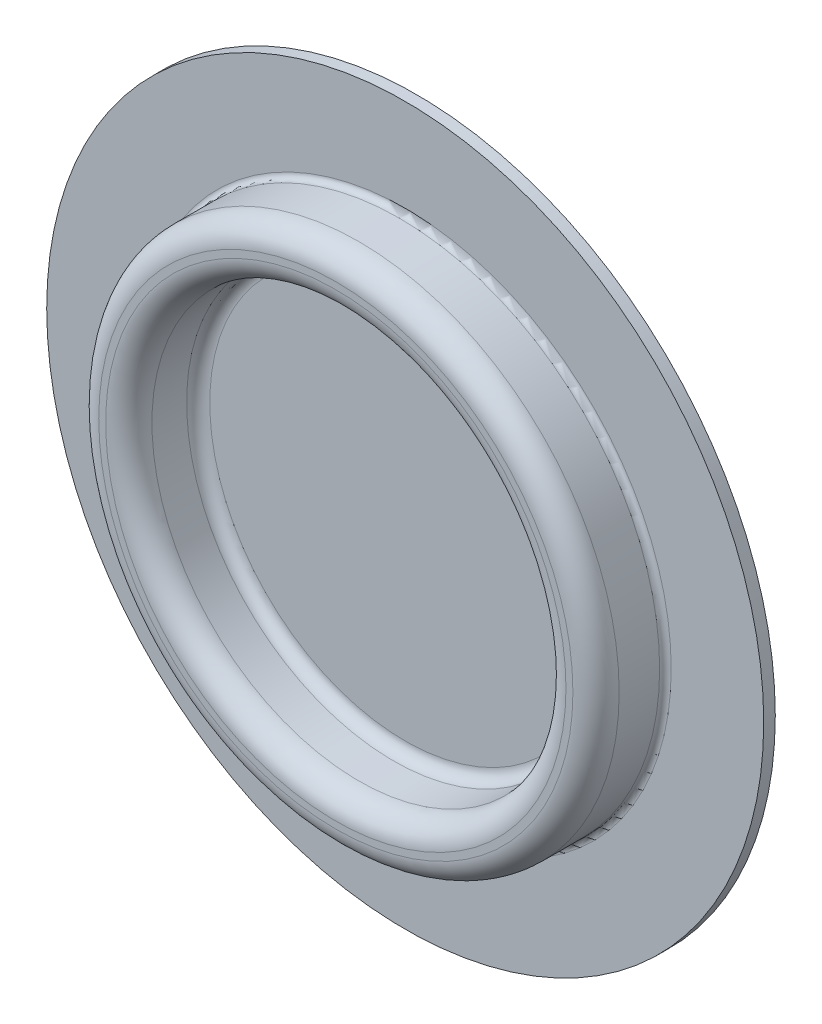
ISO-10303-21;
HEADER;
FILE_DESCRIPTION(('STEP AP214'),'2;1');
FILE_NAME('part.step','',(''),(''),'','','');
FILE_SCHEMA(('AUTOMOTIVE_DESIGN { 1 0 10303 214 1 1 1 1 }'));
ENDSEC;
DATA;
#1=APPLICATION_CONTEXT('core data for automotive mechanical design processes');
#2=APPLICATION_PROTOCOL_DEFINITION('international standard','automotive_design',2000,#1);
#3=PRODUCT_CONTEXT('',#1,'mechanical');
#4=PRODUCT('Part','Part','',(#3));
#5=PRODUCT_RELATED_PRODUCT_CATEGORY('part','',(#4));
#6=PRODUCT_DEFINITION_FORMATION('','',#4);
#7=PRODUCT_DEFINITION_CONTEXT('part definition',#1,'design');
#8=PRODUCT_DEFINITION('design','',#6,#7);
#9=PRODUCT_DEFINITION_SHAPE('','',#8);
#10=(LENGTH_UNIT() NAMED_UNIT(*) SI_UNIT(.MILLI.,.METRE.));
#11=(NAMED_UNIT(*) PLANE_ANGLE_UNIT() SI_UNIT($,.RADIAN.));
#12=(NAMED_UNIT(*) SI_UNIT($,.STERADIAN.) SOLID_ANGLE_UNIT());
#13=UNCERTAINTY_MEASURE_WITH_UNIT(LENGTH_MEASURE(1.E-05),#10,'distance_accuracy_value','');
#14=(GEOMETRIC_REPRESENTATION_CONTEXT(3) GLOBAL_UNCERTAINTY_ASSIGNED_CONTEXT((#13)) GLOBAL_UNIT_ASSIGNED_CONTEXT((#10,
#11,#12)) REPRESENTATION_CONTEXT('',''));
#15=CARTESIAN_POINT('',(0.,0.,0.));
#16=DIRECTION('',(0.,0.,1.));
#17=DIRECTION('',(1.,0.,0.));
#18=AXIS2_PLACEMENT_3D('',#15,#16,#17);
#19=CARTESIAN_POINT('',(0.,0.,74.4769920566214));
#20=DIRECTION('',(0.,0.,1.));
#21=DIRECTION('',(1.,0.,0.));
#22=AXIS2_PLACEMENT_3D('',#19,#20,#21);
#23=CYLINDRICAL_SURFACE('',#22,31.);
#24=CARTESIAN_POINT('',(0.,0.,1.));
#25=DIRECTION('',(0.,0.,1.));
#26=DIRECTION('',(1.,0.,0.));
#27=AXIS2_PLACEMENT_3D('',#24,#25,#26);
#28=CIRCLE('',#27,31.);
#29=CARTESIAN_POINT('',(31.,0.,1.));
#30=VERTEX_POINT('',#29);
#31=EDGE_CURVE('E10',#30,#30,#28,.T.);
#32=ORIENTED_EDGE('',*,*,#31,.F.);
#33=EDGE_LOOP('',(#32));
#34=FACE_BOUND('',#33,.T.);
#35=CARTESIAN_POINT('',(0.,0.,0.));
#36=DIRECTION('',(0.,0.,1.));
#37=DIRECTION('',(1.,0.,0.));
#38=AXIS2_PLACEMENT_3D('',#35,#36,#37);
#39=CIRCLE('',#38,31.);
#40=CARTESIAN_POINT('',(31.,0.,0.));
#41=VERTEX_POINT('',#40);
#42=EDGE_CURVE('E91',#41,#41,#39,.T.);
#43=ORIENTED_EDGE('',*,*,#42,.T.);
#44=EDGE_LOOP('',(#43));
#45=FACE_BOUND('',#44,.T.);
#46=ADVANCED_FACE('F33',(#34,#45),#23,.T.);
#47=CARTESIAN_POINT('',(0.,31.,1.));
#48=DIRECTION('',(0.,0.,-1.));
#49=DIRECTION('',(-1.,0.,0.));
#50=AXIS2_PLACEMENT_3D('',#47,#48,#49);
#51=PLANE('',#50);
#52=CARTESIAN_POINT('',(0.,0.,1.));
#53=DIRECTION('',(0.,0.,1.));
#54=DIRECTION('',(1.,0.,0.));
#55=AXIS2_PLACEMENT_3D('',#52,#53,#54);
#56=CIRCLE('',#55,23.);
#57=CARTESIAN_POINT('',(23.,0.,1.));
#58=VERTEX_POINT('',#57);
#59=EDGE_CURVE('E39',#58,#58,#56,.T.);
#60=ORIENTED_EDGE('',*,*,#59,.F.);
#61=EDGE_LOOP('',(#60));
#62=FACE_BOUND('',#61,.T.);
#63=ORIENTED_EDGE('',*,*,#31,.T.);
#64=EDGE_LOOP('',(#63));
#65=FACE_BOUND('',#64,.T.);
#66=ADVANCED_FACE('F155',(#62,#65),#51,.F.);
#67=CARTESIAN_POINT('',(0.,0.,1.5));
#68=DIRECTION('',(0.,0.,1.));
#69=DIRECTION('',(1.,0.,0.));
#70=AXIS2_PLACEMENT_3D('',#67,#68,#69);
#71=TOROIDAL_SURFACE('',#70,23.,0.5);
#72=CARTESIAN_POINT('',(0.,0.,1.5));
#73=DIRECTION('',(0.,0.,1.));
#74=DIRECTION('',(1.,0.,0.));
#75=AXIS2_PLACEMENT_3D('',#72,#73,#74);
#76=CIRCLE('',#75,22.5);
#77=CARTESIAN_POINT('',(22.5,0.,1.5));
#78=VERTEX_POINT('',#77);
#79=EDGE_CURVE('E43',#78,#78,#76,.T.);
#80=ORIENTED_EDGE('',*,*,#79,.F.);
#81=EDGE_LOOP('',(#80));
#82=FACE_BOUND('',#81,.T.);
#83=ORIENTED_EDGE('',*,*,#59,.T.);
#84=EDGE_LOOP('',(#83));
#85=FACE_BOUND('',#84,.T.);
#86=ADVANCED_FACE('F160',(#82,#85),#71,.F.);
#87=CARTESIAN_POINT('',(0.,0.,74.4769920566214));
#88=DIRECTION('',(0.,0.,1.));
#89=DIRECTION('',(1.,0.,0.));
#90=AXIS2_PLACEMENT_3D('',#87,#88,#89);
#91=CYLINDRICAL_SURFACE('',#90,22.5);
#92=CARTESIAN_POINT('',(0.,0.,5.));
#93=DIRECTION('',(0.,0.,1.));
#94=DIRECTION('',(1.,0.,0.));
#95=AXIS2_PLACEMENT_3D('',#92,#93,#94);
#96=CIRCLE('',#95,22.5);
#97=CARTESIAN_POINT('',(22.5,0.,5.));
#98=VERTEX_POINT('',#97);
#99=EDGE_CURVE('E47',#98,#98,#96,.T.);
#100=ORIENTED_EDGE('',*,*,#99,.F.);
#101=EDGE_LOOP('',(#100));
#102=FACE_BOUND('',#101,.T.);
#103=ORIENTED_EDGE('',*,*,#79,.T.);
#104=EDGE_LOOP('',(#103));
#105=FACE_BOUND('',#104,.T.);
#106=ADVANCED_FACE('F165',(#102,#105),#91,.T.);
#107=CARTESIAN_POINT('',(0.,0.,5.));
#108=DIRECTION('',(0.,0.,1.));
#109=DIRECTION('',(1.,0.,0.));
#110=AXIS2_PLACEMENT_3D('',#107,#108,#109);
#111=TOROIDAL_SURFACE('',#110,20.5,2.);
#112=CARTESIAN_POINT('',(0.,0.,7.00000000000001));
#113=DIRECTION('',(0.,0.,1.));
#114=DIRECTION('',(1.,0.,0.));
#115=AXIS2_PLACEMENT_3D('',#112,#113,#114);
#116=CIRCLE('',#115,20.5);
#117=CARTESIAN_POINT('',(20.5,0.,7.00000000000001));
#118=VERTEX_POINT('',#117);
#119=EDGE_CURVE('E52',#118,#118,#116,.T.);
#120=ORIENTED_EDGE('',*,*,#119,.F.);
#121=EDGE_LOOP('',(#120));
#122=FACE_BOUND('',#121,.T.);
#123=ORIENTED_EDGE('',*,*,#99,.T.);
#124=EDGE_LOOP('',(#123));
#125=FACE_BOUND('',#124,.T.);
#126=ADVANCED_FACE('F171',(#122,#125),#111,.T.);
#127=CARTESIAN_POINT('',(0.,20.5,7.));
#128=DIRECTION('',(0.,0.,-1.));
#129=DIRECTION('',(-1.,0.,0.));
#130=AXIS2_PLACEMENT_3D('',#127,#128,#129);
#131=PLANE('',#130);
#132=CARTESIAN_POINT('',(0.,0.,7.00000000000001));
#133=DIRECTION('',(0.,0.,1.));
#134=DIRECTION('',(1.,0.,0.));
#135=AXIS2_PLACEMENT_3D('',#132,#133,#134);
#136=CIRCLE('',#135,19.9);
#137=CARTESIAN_POINT('',(19.9,0.,7.00000000000001));
#138=VERTEX_POINT('',#137);
#139=EDGE_CURVE('E55',#138,#138,#136,.T.);
#140=ORIENTED_EDGE('',*,*,#139,.F.);
#141=EDGE_LOOP('',(#140));
#142=FACE_BOUND('',#141,.T.);
#143=ORIENTED_EDGE('',*,*,#119,.T.);
#144=EDGE_LOOP('',(#143));
#145=FACE_BOUND('',#144,.T.);
#146=ADVANCED_FACE('F175',(#142,#145),#131,.F.);
#147=CARTESIAN_POINT('',(0.,0.,5.));
#148=DIRECTION('',(0.,0.,1.));
#149=DIRECTION('',(1.,0.,0.));
#150=AXIS2_PLACEMENT_3D('',#147,#148,#149);
#151=TOROIDAL_SURFACE('',#150,19.9,2.);
#152=CARTESIAN_POINT('',(0.,0.,4.99999999999999));
#153=DIRECTION('',(0.,0.,1.));
#154=DIRECTION('',(1.,0.,0.));
#155=AXIS2_PLACEMENT_3D('',#152,#153,#154);
#156=CIRCLE('',#155,17.9);
#157=CARTESIAN_POINT('',(17.9,0.,4.99999999999999));
#158=VERTEX_POINT('',#157);
#159=EDGE_CURVE('E58',#158,#158,#156,.T.);
#160=ORIENTED_EDGE('',*,*,#159,.F.);
#161=EDGE_LOOP('',(#160));
#162=FACE_BOUND('',#161,.T.);
#163=ORIENTED_EDGE('',*,*,#139,.T.);
#164=EDGE_LOOP('',(#163));
#165=FACE_BOUND('',#164,.T.);
#166=ADVANCED_FACE('F179',(#162,#165),#151,.T.);
#167=CARTESIAN_POINT('',(0.,0.,74.4769920566214));
#168=DIRECTION('',(0.,0.,1.));
#169=DIRECTION('',(1.,0.,0.));
#170=AXIS2_PLACEMENT_3D('',#167,#168,#169);
#171=CYLINDRICAL_SURFACE('',#170,17.9);
#172=CARTESIAN_POINT('',(0.,0.,2.));
#173=DIRECTION('',(0.,0.,1.));
#174=DIRECTION('',(1.,0.,0.));
#175=AXIS2_PLACEMENT_3D('',#172,#173,#174);
#176=CIRCLE('',#175,17.9);
#177=CARTESIAN_POINT('',(17.9,0.,2.));
#178=VERTEX_POINT('',#177);
#179=EDGE_CURVE('E61',#178,#178,#176,.T.);
#180=ORIENTED_EDGE('',*,*,#179,.F.);
#181=EDGE_LOOP('',(#180));
#182=FACE_BOUND('',#181,.T.);
#183=ORIENTED_EDGE('',*,*,#159,.T.);
#184=EDGE_LOOP('',(#183));
#185=FACE_BOUND('',#184,.T.);
#186=ADVANCED_FACE('F183',(#182,#185),#171,.F.);
#187=CARTESIAN_POINT('',(0.,0.,2.));
#188=DIRECTION('',(0.,0.,1.));
#189=DIRECTION('',(1.,0.,0.));
#190=AXIS2_PLACEMENT_3D('',#187,#188,#189);
#191=TOROIDAL_SURFACE('',#190,16.9,0.999999999999999);
#192=CARTESIAN_POINT('',(0.,0.,1.));
#193=DIRECTION('',(0.,0.,1.));
#194=DIRECTION('',(1.,0.,0.));
#195=AXIS2_PLACEMENT_3D('',#192,#193,#194);
#196=CIRCLE('',#195,16.9);
#197=CARTESIAN_POINT('',(16.9,0.,1.));
#198=VERTEX_POINT('',#197);
#199=EDGE_CURVE('E64',#198,#198,#196,.T.);
#200=ORIENTED_EDGE('',*,*,#199,.F.);
#201=EDGE_LOOP('',(#200));
#202=FACE_BOUND('',#201,.T.);
#203=ORIENTED_EDGE('',*,*,#179,.T.);
#204=EDGE_LOOP('',(#203));
#205=FACE_BOUND('',#204,.T.);
#206=ADVANCED_FACE('F151',(#202,#205),#191,.F.);
#207=CARTESIAN_POINT('',(0.,1.57282630399508E-10,0.999999999997762));
#208=DIRECTION('',(0.,0.,-1.));
#209=DIRECTION('',(-1.,0.,0.));
#210=AXIS2_PLACEMENT_3D('',#207,#208,#209);
#211=PLANE('',#210);
#212=ORIENTED_EDGE('',*,*,#199,.T.);
#213=EDGE_LOOP('',(#212));
#214=FACE_BOUND('',#213,.T.);
#215=ADVANCED_FACE('F146',(#214),#211,.F.);
#216=CARTESIAN_POINT('',(0.,0.,-2.36788366692053E-09));
#217=DIRECTION('',(0.,0.,1.));
#218=DIRECTION('',(1.,0.,0.));
#219=AXIS2_PLACEMENT_3D('',#216,#217,#218);
#220=PLANE('',#219);
#221=CARTESIAN_POINT('',(0.,0.,0.));
#222=DIRECTION('',(0.,0.,1.));
#223=DIRECTION('',(1.,0.,0.));
#224=AXIS2_PLACEMENT_3D('',#221,#222,#223);
#225=CIRCLE('',#224,16.9);
#226=CARTESIAN_POINT('',(16.9,0.,0.));
#227=VERTEX_POINT('',#226);
#228=EDGE_CURVE('E67',#227,#227,#225,.T.);
#229=ORIENTED_EDGE('',*,*,#228,.F.);
#230=EDGE_LOOP('',(#229));
#231=FACE_BOUND('',#230,.T.);
#232=ADVANCED_FACE('F141',(#231),#220,.F.);
#233=CARTESIAN_POINT('',(0.,0.,2.));
#234=DIRECTION('',(0.,0.,1.));
#235=DIRECTION('',(1.,0.,0.));
#236=AXIS2_PLACEMENT_3D('',#233,#234,#235);
#237=TOROIDAL_SURFACE('',#236,16.9,2.);
#238=CARTESIAN_POINT('',(0.,0.,2.));
#239=DIRECTION('',(0.,0.,1.));
#240=DIRECTION('',(1.,0.,0.));
#241=AXIS2_PLACEMENT_3D('',#238,#239,#240);
#242=CIRCLE('',#241,18.9);
#243=CARTESIAN_POINT('',(18.9,0.,2.));
#244=VERTEX_POINT('',#243);
#245=EDGE_CURVE('E70',#244,#244,#242,.T.);
#246=ORIENTED_EDGE('',*,*,#245,.F.);
#247=EDGE_LOOP('',(#246));
#248=FACE_BOUND('',#247,.T.);
#249=ORIENTED_EDGE('',*,*,#228,.T.);
#250=EDGE_LOOP('',(#249));
#251=FACE_BOUND('',#250,.T.);
#252=ADVANCED_FACE('F135',(#248,#251),#237,.T.);
#253=CARTESIAN_POINT('',(0.,0.,74.4769920566214));
#254=DIRECTION('',(0.,0.,1.));
#255=DIRECTION('',(1.,0.,0.));
#256=AXIS2_PLACEMENT_3D('',#253,#254,#255);
#257=CYLINDRICAL_SURFACE('',#256,18.9);
#258=CARTESIAN_POINT('',(0.,0.,4.99999999999999));
#259=DIRECTION('',(0.,0.,1.));
#260=DIRECTION('',(1.,0.,0.));
#261=AXIS2_PLACEMENT_3D('',#258,#259,#260);
#262=CIRCLE('',#261,18.9);
#263=CARTESIAN_POINT('',(18.9,0.,4.99999999999999));
#264=VERTEX_POINT('',#263);
#265=EDGE_CURVE('E73',#264,#264,#262,.T.);
#266=ORIENTED_EDGE('',*,*,#265,.F.);
#267=EDGE_LOOP('',(#266));
#268=FACE_BOUND('',#267,.T.);
#269=ORIENTED_EDGE('',*,*,#245,.T.);
#270=EDGE_LOOP('',(#269));
#271=FACE_BOUND('',#270,.T.);
#272=ADVANCED_FACE('F129',(#268,#271),#257,.T.);
#273=CARTESIAN_POINT('',(0.,0.,5.));
#274=DIRECTION('',(0.,0.,1.));
#275=DIRECTION('',(1.,0.,0.));
#276=AXIS2_PLACEMENT_3D('',#273,#274,#275);
#277=TOROIDAL_SURFACE('',#276,19.9,1.);
#278=CARTESIAN_POINT('',(0.,0.,6.00000000000001));
#279=DIRECTION('',(0.,0.,1.));
#280=DIRECTION('',(1.,0.,0.));
#281=AXIS2_PLACEMENT_3D('',#278,#279,#280);
#282=CIRCLE('',#281,19.9);
#283=CARTESIAN_POINT('',(19.9,0.,6.00000000000001));
#284=VERTEX_POINT('',#283);
#285=EDGE_CURVE('E76',#284,#284,#282,.T.);
#286=ORIENTED_EDGE('',*,*,#285,.F.);
#287=EDGE_LOOP('',(#286));
#288=FACE_BOUND('',#287,.T.);
#289=ORIENTED_EDGE('',*,*,#265,.T.);
#290=EDGE_LOOP('',(#289));
#291=FACE_BOUND('',#290,.T.);
#292=ADVANCED_FACE('F123',(#288,#291),#277,.F.);
#293=CARTESIAN_POINT('',(0.,20.5,6.));
#294=DIRECTION('',(0.,0.,1.));
#295=DIRECTION('',(1.,0.,0.));
#296=AXIS2_PLACEMENT_3D('',#293,#294,#295);
#297=PLANE('',#296);
#298=CARTESIAN_POINT('',(0.,0.,6.00000000000001));
#299=DIRECTION('',(0.,0.,1.));
#300=DIRECTION('',(1.,0.,0.));
#301=AXIS2_PLACEMENT_3D('',#298,#299,#300);
#302=CIRCLE('',#301,20.5);
#303=CARTESIAN_POINT('',(20.5,0.,6.00000000000001));
#304=VERTEX_POINT('',#303);
#305=EDGE_CURVE('E79',#304,#304,#302,.T.);
#306=ORIENTED_EDGE('',*,*,#305,.F.);
#307=EDGE_LOOP('',(#306));
#308=FACE_BOUND('',#307,.T.);
#309=ORIENTED_EDGE('',*,*,#285,.T.);
#310=EDGE_LOOP('',(#309));
#311=FACE_BOUND('',#310,.T.);
#312=ADVANCED_FACE('F117',(#308,#311),#297,.F.);
#313=CARTESIAN_POINT('',(0.,0.,5.));
#314=DIRECTION('',(0.,0.,1.));
#315=DIRECTION('',(1.,0.,0.));
#316=AXIS2_PLACEMENT_3D('',#313,#314,#315);
#317=TOROIDAL_SURFACE('',#316,20.5,1.);
#318=CARTESIAN_POINT('',(0.,0.,5.));
#319=DIRECTION('',(0.,0.,1.));
#320=DIRECTION('',(1.,0.,0.));
#321=AXIS2_PLACEMENT_3D('',#318,#319,#320);
#322=CIRCLE('',#321,21.5);
#323=CARTESIAN_POINT('',(21.5,0.,5.));
#324=VERTEX_POINT('',#323);
#325=EDGE_CURVE('E82',#324,#324,#322,.T.);
#326=ORIENTED_EDGE('',*,*,#325,.F.);
#327=EDGE_LOOP('',(#326));
#328=FACE_BOUND('',#327,.T.);
#329=ORIENTED_EDGE('',*,*,#305,.T.);
#330=EDGE_LOOP('',(#329));
#331=FACE_BOUND('',#330,.T.);
#332=ADVANCED_FACE('F111',(#328,#331),#317,.F.);
#333=CARTESIAN_POINT('',(0.,0.,74.4769920566214));
#334=DIRECTION('',(0.,0.,1.));
#335=DIRECTION('',(1.,0.,0.));
#336=AXIS2_PLACEMENT_3D('',#333,#334,#335);
#337=CYLINDRICAL_SURFACE('',#336,21.5);
#338=CARTESIAN_POINT('',(0.,0.,1.5));
#339=DIRECTION('',(0.,0.,1.));
#340=DIRECTION('',(1.,0.,0.));
#341=AXIS2_PLACEMENT_3D('',#338,#339,#340);
#342=CIRCLE('',#341,21.5);
#343=CARTESIAN_POINT('',(21.5,0.,1.5));
#344=VERTEX_POINT('',#343);
#345=EDGE_CURVE('E85',#344,#344,#342,.T.);
#346=ORIENTED_EDGE('',*,*,#345,.F.);
#347=EDGE_LOOP('',(#346));
#348=FACE_BOUND('',#347,.T.);
#349=ORIENTED_EDGE('',*,*,#325,.T.);
#350=EDGE_LOOP('',(#349));
#351=FACE_BOUND('',#350,.T.);
#352=ADVANCED_FACE('F105',(#348,#351),#337,.F.);
#353=CARTESIAN_POINT('',(0.,0.,1.5));
#354=DIRECTION('',(0.,0.,1.));
#355=DIRECTION('',(1.,0.,0.));
#356=AXIS2_PLACEMENT_3D('',#353,#354,#355);
#357=TOROIDAL_SURFACE('',#356,23.,1.5);
#358=CARTESIAN_POINT('',(0.,0.,0.));
#359=DIRECTION('',(0.,0.,1.));
#360=DIRECTION('',(1.,0.,0.));
#361=AXIS2_PLACEMENT_3D('',#358,#359,#360);
#362=CIRCLE('',#361,23.);
#363=CARTESIAN_POINT('',(23.,0.,0.));
#364=VERTEX_POINT('',#363);
#365=EDGE_CURVE('E88',#364,#364,#362,.T.);
#366=ORIENTED_EDGE('',*,*,#365,.F.);
#367=EDGE_LOOP('',(#366));
#368=FACE_BOUND('',#367,.T.);
#369=ORIENTED_EDGE('',*,*,#345,.T.);
#370=EDGE_LOOP('',(#369));
#371=FACE_BOUND('',#370,.T.);
#372=ADVANCED_FACE('F99',(#368,#371),#357,.T.);
#373=CARTESIAN_POINT('',(0.,31.,0.));
#374=DIRECTION('',(0.,0.,1.));
#375=DIRECTION('',(1.,0.,0.));
#376=AXIS2_PLACEMENT_3D('',#373,#374,#375);
#377=PLANE('',#376);
#378=ORIENTED_EDGE('',*,*,#42,.F.);
#379=EDGE_LOOP('',(#378));
#380=FACE_BOUND('',#379,.T.);
#381=ORIENTED_EDGE('',*,*,#365,.T.);
#382=EDGE_LOOP('',(#381));
#383=FACE_BOUND('',#382,.T.);
#384=ADVANCED_FACE('F96',(#380,#383),#377,.F.);
#385=CLOSED_SHELL('',(#46,#66,#86,#106,#126,#146,#166,#186,#206,#215,#232,#252,#272,#292,#312,
#332,#352,#372,#384));
#386=MANIFOLD_SOLID_BREP('B2',#385);
#387=ADVANCED_BREP_SHAPE_REPRESENTATION('',(#18,#386),#14);
#388=SHAPE_DEFINITION_REPRESENTATION(#9,#387);
ENDSEC;
END-ISO-10303-21;
